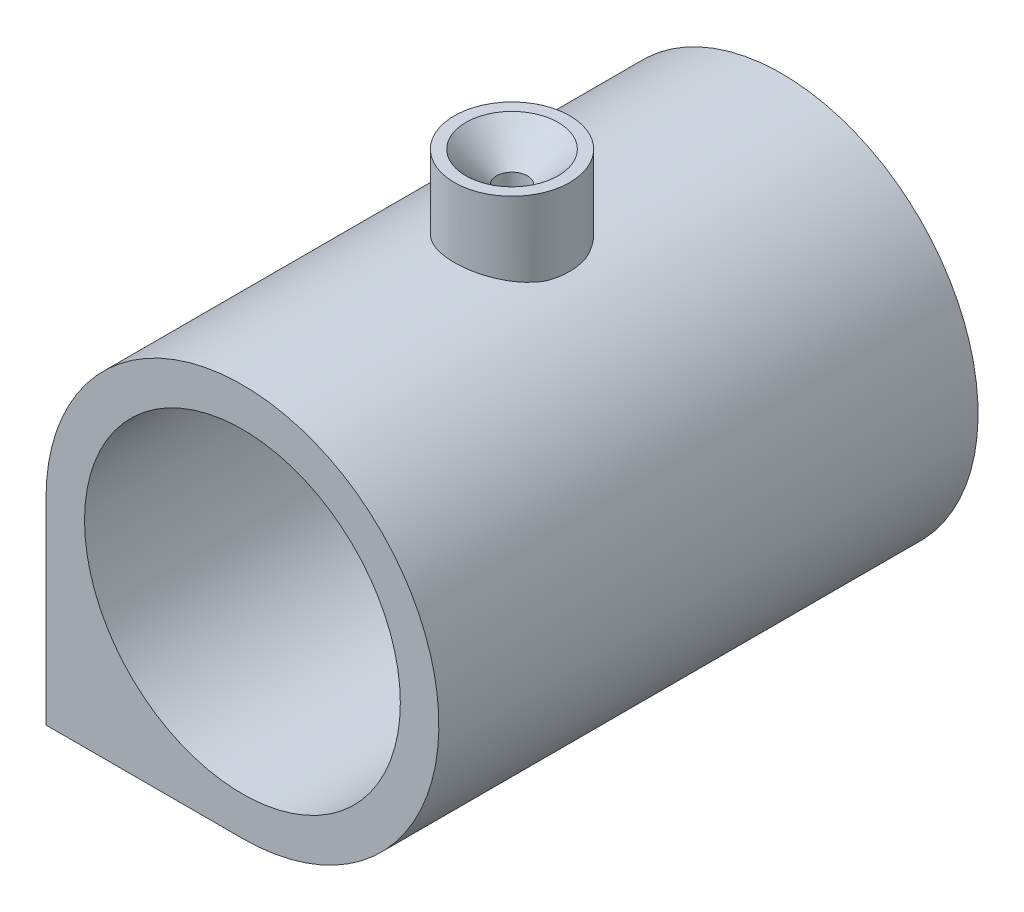
ISO-10303-21;
HEADER;
FILE_DESCRIPTION(('STEP AP214'),'2;1');
FILE_NAME('part.step','',(''),(''),'','','');
FILE_SCHEMA(('AUTOMOTIVE_DESIGN { 1 0 10303 214 1 1 1 1 }'));
ENDSEC;
DATA;
#1=APPLICATION_CONTEXT('core data for automotive mechanical design processes');
#2=APPLICATION_PROTOCOL_DEFINITION('international standard','automotive_design',2000,#1);
#3=PRODUCT_CONTEXT('',#1,'mechanical');
#4=PRODUCT('Part','Part','',(#3));
#5=PRODUCT_RELATED_PRODUCT_CATEGORY('part','',(#4));
#6=PRODUCT_DEFINITION_FORMATION('','',#4);
#7=PRODUCT_DEFINITION_CONTEXT('part definition',#1,'design');
#8=PRODUCT_DEFINITION('design','',#6,#7);
#9=PRODUCT_DEFINITION_SHAPE('','',#8);
#10=(LENGTH_UNIT() NAMED_UNIT(*) SI_UNIT(.MILLI.,.METRE.));
#11=(NAMED_UNIT(*) PLANE_ANGLE_UNIT() SI_UNIT($,.RADIAN.));
#12=(NAMED_UNIT(*) SI_UNIT($,.STERADIAN.) SOLID_ANGLE_UNIT());
#13=UNCERTAINTY_MEASURE_WITH_UNIT(LENGTH_MEASURE(1.E-05),#10,'distance_accuracy_value','');
#14=(GEOMETRIC_REPRESENTATION_CONTEXT(3) GLOBAL_UNCERTAINTY_ASSIGNED_CONTEXT((#13)) GLOBAL_UNIT_ASSIGNED_CONTEXT((#10,
#11,#12)) REPRESENTATION_CONTEXT('',''));
#15=CARTESIAN_POINT('',(0.,0.,0.));
#16=DIRECTION('',(0.,0.,1.));
#17=DIRECTION('',(1.,0.,0.));
#18=AXIS2_PLACEMENT_3D('',#15,#16,#17);
#19=CARTESIAN_POINT('',(77.5,0.,0.));
#20=DIRECTION('',(-1.,0.,0.));
#21=DIRECTION('',(0.,-1.,0.));
#22=AXIS2_PLACEMENT_3D('',#19,#20,#21);
#23=PLANE('',#22);
#24=DIRECTION('',(0.,1.,0.));
#25=VECTOR('',#24,1.);
#26=CARTESIAN_POINT('',(77.5,7.75,30.25));
#27=LINE('',#26,#25);
#28=CARTESIAN_POINT('',(77.5,2.25,30.25));
#29=VERTEX_POINT('',#28);
#30=CARTESIAN_POINT('',(77.5,7.75,30.25));
#31=VERTEX_POINT('',#30);
#32=EDGE_CURVE('E56',#29,#31,#27,.T.);
#33=ORIENTED_EDGE('',*,*,#32,.F.);
#34=DIRECTION('',(0.,0.,1.));
#35=VECTOR('',#34,1.);
#36=CARTESIAN_POINT('',(77.5,2.25,-30.25));
#37=LINE('',#36,#35);
#38=CARTESIAN_POINT('',(77.5,2.25,-30.25));
#39=VERTEX_POINT('',#38);
#40=EDGE_CURVE('E132',#39,#29,#37,.T.);
#41=ORIENTED_EDGE('',*,*,#40,.F.);
#42=DIRECTION('',(0.,-1.,0.));
#43=VECTOR('',#42,1.);
#44=CARTESIAN_POINT('',(77.5,7.75,-30.25));
#45=LINE('',#44,#43);
#46=CARTESIAN_POINT('',(77.5,7.75,-30.25));
#47=VERTEX_POINT('',#46);
#48=EDGE_CURVE('E135',#47,#39,#45,.T.);
#49=ORIENTED_EDGE('',*,*,#48,.F.);
#50=DIRECTION('',(0.,0.,-1.));
#51=VECTOR('',#50,1.);
#52=CARTESIAN_POINT('',(77.5,7.75,-30.25));
#53=LINE('',#52,#51);
#54=EDGE_CURVE('E141',#31,#47,#53,.T.);
#55=ORIENTED_EDGE('',*,*,#54,.F.);
#56=EDGE_LOOP('',(#33,#41,#49,#55));
#57=FACE_BOUND('',#56,.T.);
#58=DIRECTION('',(0.,0.,1.));
#59=VECTOR('',#58,1.);
#60=CARTESIAN_POINT('',(77.5,0.,0.));
#61=LINE('',#60,#59);
#62=CARTESIAN_POINT('',(77.5,0.,-35.));
#63=VERTEX_POINT('',#62);
#64=CARTESIAN_POINT('',(77.5,0.,35.));
#65=VERTEX_POINT('',#64);
#66=EDGE_CURVE('E43',#63,#65,#61,.T.);
#67=ORIENTED_EDGE('',*,*,#66,.T.);
#68=DIRECTION('',(0.,-1.,0.));
#69=VECTOR('',#68,1.);
#70=CARTESIAN_POINT('',(77.5,0.,35.));
#71=LINE('',#70,#69);
#72=CARTESIAN_POINT('',(77.5,25.5,35.));
#73=VERTEX_POINT('',#72);
#74=EDGE_CURVE('E223',#73,#65,#71,.T.);
#75=ORIENTED_EDGE('',*,*,#74,.F.);
#76=DIRECTION('',(0.,0.,-1.));
#77=VECTOR('',#76,1.);
#78=CARTESIAN_POINT('',(77.5,25.5,35.));
#79=LINE('',#78,#77);
#80=CARTESIAN_POINT('',(77.5,25.5,-35.));
#81=VERTEX_POINT('',#80);
#82=EDGE_CURVE('E208',#73,#81,#79,.T.);
#83=ORIENTED_EDGE('',*,*,#82,.T.);
#84=DIRECTION('',(0.,-1.,0.));
#85=VECTOR('',#84,1.);
#86=CARTESIAN_POINT('',(77.5,0.,-35.));
#87=LINE('',#86,#85);
#88=EDGE_CURVE('E226',#81,#63,#87,.T.);
#89=ORIENTED_EDGE('',*,*,#88,.T.);
#90=EDGE_LOOP('',(#67,#75,#83,#89));
#91=FACE_BOUND('',#90,.T.);
#92=ADVANCED_FACE('F39',(#57,#91),#23,.T.);
#93=CARTESIAN_POINT('',(103.,56.,0.));
#94=DIRECTION('',(0.,1.,0.));
#95=DIRECTION('',(0.,0.,1.));
#96=AXIS2_PLACEMENT_3D('',#93,#94,#95);
#97=CONICAL_SURFACE('',#96,2.,0.785398163397447);
#98=CARTESIAN_POINT('',(103.,60.,0.));
#99=DIRECTION('',(0.,1.,0.));
#100=DIRECTION('',(0.,0.,1.));
#101=AXIS2_PLACEMENT_3D('',#98,#99,#100);
#102=CIRCLE('',#101,6.00000000000001);
#103=CARTESIAN_POINT('',(103.,60.,5.99999999999999));
#104=VERTEX_POINT('',#103);
#105=EDGE_CURVE('E150',#104,#104,#102,.F.);
#106=CARTESIAN_POINT('',(103.,56.,0.));
#107=DIRECTION('',(0.,1.,0.));
#108=DIRECTION('',(0.,0.,1.));
#109=AXIS2_PLACEMENT_3D('',#106,#107,#108);
#110=CIRCLE('',#109,2.);
#111=CARTESIAN_POINT('',(103.,56.,1.99999999999999));
#112=VERTEX_POINT('',#111);
#113=EDGE_CURVE('E153',#112,#112,#110,.T.);
#114=CARTESIAN_POINT('',(103.,60.,5.99999999999999));
#115=CARTESIAN_POINT('',(103.,59.9583333333333,5.95833333333333));
#116=CARTESIAN_POINT('',(103.,59.9166666666667,5.91666666666666));
#117=CARTESIAN_POINT('',(103.,59.8333333333333,5.83333333333333));
#118=CARTESIAN_POINT('',(103.,59.7916666666667,5.79166666666666));
#119=CARTESIAN_POINT('',(103.,59.7083333333333,5.70833333333333));
#120=CARTESIAN_POINT('',(103.,59.6666666666667,5.66666666666666));
#121=CARTESIAN_POINT('',(103.,59.5833333333333,5.58333333333333));
#122=CARTESIAN_POINT('',(103.,59.5416666666667,5.54166666666666));
#123=CARTESIAN_POINT('',(103.,59.4583333333333,5.45833333333333));
#124=CARTESIAN_POINT('',(103.,59.4166666666667,5.41666666666666));
#125=CARTESIAN_POINT('',(103.,59.3333333333333,5.33333333333333));
#126=CARTESIAN_POINT('',(103.,59.2916666666667,5.29166666666666));
#127=CARTESIAN_POINT('',(103.,59.2083333333333,5.20833333333333));
#128=CARTESIAN_POINT('',(103.,59.1666666666667,5.16666666666666));
#129=CARTESIAN_POINT('',(103.,59.0833333333333,5.08333333333333));
#130=CARTESIAN_POINT('',(103.,59.0416666666667,5.04166666666666));
#131=CARTESIAN_POINT('',(103.,58.9583333333333,4.95833333333333));
#132=CARTESIAN_POINT('',(103.,58.9166666666667,4.91666666666666));
#133=CARTESIAN_POINT('',(103.,58.8333333333333,4.83333333333333));
#134=CARTESIAN_POINT('',(103.,58.7916666666667,4.79166666666666));
#135=CARTESIAN_POINT('',(103.,58.7083333333333,4.70833333333333));
#136=CARTESIAN_POINT('',(103.,58.6666666666667,4.66666666666666));
#137=CARTESIAN_POINT('',(103.,58.5833333333333,4.58333333333333));
#138=CARTESIAN_POINT('',(103.,58.5416666666667,4.54166666666666));
#139=CARTESIAN_POINT('',(103.,58.4583333333333,4.45833333333332));
#140=CARTESIAN_POINT('',(103.,58.4166666666667,4.41666666666666));
#141=CARTESIAN_POINT('',(103.,58.3333333333333,4.33333333333332));
#142=CARTESIAN_POINT('',(103.,58.2916666666667,4.29166666666666));
#143=CARTESIAN_POINT('',(103.,58.2083333333333,4.20833333333332));
#144=CARTESIAN_POINT('',(103.,58.1666666666667,4.16666666666666));
#145=CARTESIAN_POINT('',(103.,58.0833333333333,4.08333333333332));
#146=CARTESIAN_POINT('',(103.,58.0416666666667,4.04166666666666));
#147=CARTESIAN_POINT('',(103.,57.9583333333333,3.95833333333332));
#148=CARTESIAN_POINT('',(103.,57.9166666666667,3.91666666666666));
#149=CARTESIAN_POINT('',(103.,57.8333333333333,3.83333333333332));
#150=CARTESIAN_POINT('',(103.,57.7916666666667,3.79166666666666));
#151=CARTESIAN_POINT('',(103.,57.7083333333333,3.70833333333332));
#152=CARTESIAN_POINT('',(103.,57.6666666666667,3.66666666666666));
#153=CARTESIAN_POINT('',(103.,57.5833333333333,3.58333333333332));
#154=CARTESIAN_POINT('',(103.,57.5416666666667,3.54166666666666));
#155=CARTESIAN_POINT('',(103.,57.4583333333333,3.45833333333332));
#156=CARTESIAN_POINT('',(103.,57.4166666666667,3.41666666666666));
#157=CARTESIAN_POINT('',(103.,57.3333333333333,3.33333333333332));
#158=CARTESIAN_POINT('',(103.,57.2916666666667,3.29166666666665));
#159=CARTESIAN_POINT('',(103.,57.2083333333333,3.20833333333332));
#160=CARTESIAN_POINT('',(103.,57.1666666666667,3.16666666666665));
#161=CARTESIAN_POINT('',(103.,57.0833333333333,3.08333333333332));
#162=CARTESIAN_POINT('',(103.,57.0416666666667,3.04166666666665));
#163=CARTESIAN_POINT('',(103.,56.9583333333333,2.95833333333332));
#164=CARTESIAN_POINT('',(103.,56.9166666666667,2.91666666666665));
#165=CARTESIAN_POINT('',(103.,56.8333333333333,2.83333333333332));
#166=CARTESIAN_POINT('',(103.,56.7916666666667,2.79166666666665));
#167=CARTESIAN_POINT('',(103.,56.7083333333333,2.70833333333332));
#168=CARTESIAN_POINT('',(103.,56.6666666666667,2.66666666666665));
#169=CARTESIAN_POINT('',(103.,56.5833333333333,2.58333333333332));
#170=CARTESIAN_POINT('',(103.,56.5416666666667,2.54166666666665));
#171=CARTESIAN_POINT('',(103.,56.4583333333333,2.45833333333332));
#172=CARTESIAN_POINT('',(103.,56.4166666666667,2.41666666666665));
#173=CARTESIAN_POINT('',(103.,56.3333333333333,2.33333333333332));
#174=CARTESIAN_POINT('',(103.,56.2916666666667,2.29166666666665));
#175=CARTESIAN_POINT('',(103.,56.2083333333333,2.20833333333332));
#176=CARTESIAN_POINT('',(103.,56.1666666666667,2.16666666666665));
#177=CARTESIAN_POINT('',(103.,56.0833333333333,2.08333333333332));
#178=CARTESIAN_POINT('',(103.,56.0416666666667,2.04166666666665));
#179=CARTESIAN_POINT('',(103.,56.,1.99999999999999));
#180=B_SPLINE_CURVE_WITH_KNOTS('',3,(#114,#115,#116,#117,#118,#119,#120,#121,#122,#123,#124,
#125,#126,#127,#128,#129,#130,#131,#132,#133,#134,#135,#136,#137,#138,#139,#140,#141,#142,#143,
#144,#145,#146,#147,#148,#149,#150,#151,#152,#153,#154,#155,#156,#157,#158,#159,#160,#161,#162,
#163,#164,#165,#166,#167,#168,#169,#170,#171,#172,#173,#174,#175,#176,#177,#178,#179),
.UNSPECIFIED.,.F.,.F.,(4,2,2,2,2,2,2,2,2,2,2,2,2,2,2,2,2,2,2,2,2,2,2,2,2,2,2,2,2,2,2,2,4),(0.,
0.176776695296638,0.353553390593275,0.530330085889912,0.707106781186549,0.883883476483186,
1.06066017177982,1.23743686707646,1.4142135623731,1.59099025766973,1.76776695296637,
1.94454364826301,2.12132034355965,2.29809703885628,2.47487373415292,2.65165042944956,
2.8284271247462,3.00520382004284,3.18198051533947,3.35875721063611,3.53553390593275,
3.71231060122939,3.88908729652602,4.06586399182266,4.2426406871193,4.41941738241593,
4.59619407771257,4.77297077300921,4.94974746830585,5.12652416360248,5.30330085889912,
5.48007755419576,5.6568542494924),.UNSPECIFIED.);
#181=EDGE_CURVE('BSEAM192',#104,#112,#180,.T.);
#182=ORIENTED_EDGE('',*,*,#105,.F.);
#183=ORIENTED_EDGE('',*,*,#113,.F.);
#184=ORIENTED_EDGE('',*,*,#181,.T.);
#185=ORIENTED_EDGE('',*,*,#181,.F.);
#186=EDGE_LOOP('',(#182,#184,#183,#185));
#187=FACE_BOUND('',#186,.T.);
#188=ADVANCED_FACE('F192',(#187),#97,.F.);
#189=CARTESIAN_POINT('',(103.,60.,0.));
#190=DIRECTION('',(0.,1.,0.));
#191=DIRECTION('',(0.,0.,1.));
#192=AXIS2_PLACEMENT_3D('',#189,#190,#191);
#193=PLANE('',#192);
#194=ORIENTED_EDGE('',*,*,#105,.T.);
#195=EDGE_LOOP('',(#194));
#196=FACE_BOUND('',#195,.T.);
#197=CARTESIAN_POINT('',(103.,60.,0.));
#198=DIRECTION('',(0.,1.,0.));
#199=DIRECTION('',(0.,0.,1.));
#200=AXIS2_PLACEMENT_3D('',#197,#198,#199);
#201=CIRCLE('',#200,7.50000000000001);
#202=CARTESIAN_POINT('',(103.,60.,7.50000000000001));
#203=VERTEX_POINT('',#202);
#204=EDGE_CURVE('E205',#203,#203,#201,.T.);
#205=ORIENTED_EDGE('',*,*,#204,.T.);
#206=EDGE_LOOP('',(#205));
#207=FACE_BOUND('',#206,.T.);
#208=ADVANCED_FACE('F188',(#196,#207),#193,.T.);
#209=CARTESIAN_POINT('',(103.,-0.001000000000001,0.));
#210=DIRECTION('',(0.,1.,0.));
#211=DIRECTION('',(0.,0.,1.));
#212=AXIS2_PLACEMENT_3D('',#209,#210,#211);
#213=CYLINDRICAL_SURFACE('',#212,2.);
#214=ORIENTED_EDGE('',*,*,#113,.T.);
#215=EDGE_LOOP('',(#214));
#216=FACE_BOUND('',#215,.T.);
#217=CARTESIAN_POINT('',(103.,46.,1.99999999999999));
#218=CARTESIAN_POINT('',(103.112055118297,45.9999987386317,1.99999514060117));
#219=CARTESIAN_POINT('',(103.22418466831,45.999071475106,1.99055103639975));
#220=CARTESIAN_POINT('',(103.445336088255,45.995461599852,1.95301866639838));
#221=CARTESIAN_POINT('',(103.554354379701,45.992777045632,1.92490976822595));
#222=CARTESIAN_POINT('',(103.766048698073,45.9859556789613,1.85087302777091));
#223=CARTESIAN_POINT('',(103.86872847494,45.9818197350429,1.80495584049775));
#224=CARTESIAN_POINT('',(104.064900752455,45.9725582727556,1.69662637479773));
#225=CARTESIAN_POINT('',(104.158395096562,45.9674329535627,1.63421741547872));
#226=CARTESIAN_POINT('',(104.333886297143,45.9567473510947,1.49444580813626));
#227=CARTESIAN_POINT('',(104.415847200191,45.9511857883102,1.41703811216867));
#228=CARTESIAN_POINT('',(104.565636011835,45.940265125924,1.24956231842826));
#229=CARTESIAN_POINT('',(104.633463272044,45.93490603562,1.15949364014534));
#230=CARTESIAN_POINT('',(104.753185959775,45.9249839183537,0.969028624111627));
#231=CARTESIAN_POINT('',(104.80504898754,45.920422518314,0.868611828470055));
#232=CARTESIAN_POINT('',(104.891164115931,45.9126279274825,0.660443008272744));
#233=CARTESIAN_POINT('',(104.925416631999,45.9093947053588,0.552691156822688));
#234=CARTESIAN_POINT('',(104.975232175371,45.9046339961254,0.333276682265682));
#235=CARTESIAN_POINT('',(104.990854685748,45.9031010812673,0.221627683845366));
#236=CARTESIAN_POINT('',(105.003150607662,45.9018976534529,-0.00271739116219227));
#237=CARTESIAN_POINT('',(104.999824494757,45.9022270937568,-0.115413441400501));
#238=CARTESIAN_POINT('',(104.974366634283,45.9047062007368,-0.33824393576703));
#239=CARTESIAN_POINT('',(104.952299786513,45.9068495855721,-0.448385874249353));
#240=CARTESIAN_POINT('',(104.890087811417,45.9127052572463,-0.66339537549614));
#241=CARTESIAN_POINT('',(104.849942450481,45.9164175643586,-0.768262870084765));
#242=CARTESIAN_POINT('',(104.752641229847,45.9250000260275,-0.969951979544357));
#243=CARTESIAN_POINT('',(104.695456525324,45.9298721411142,-1.06675959194209));
#244=CARTESIAN_POINT('',(104.565720618827,45.940223572557,-1.24942771363365));
#245=CARTESIAN_POINT('',(104.493168988901,45.9457029058215,-1.33528791794737));
#246=CARTESIAN_POINT('',(104.33439598481,45.9566793757017,-1.49400113346195));
#247=CARTESIAN_POINT('',(104.248118552542,45.962176490598,-1.56679807872253));
#248=CARTESIAN_POINT('',(104.064537843663,45.9725474048768,-1.69688395130023));
#249=CARTESIAN_POINT('',(103.967234555576,45.9774212036104,-1.75417286247561));
#250=CARTESIAN_POINT('',(103.764325751896,45.9859978296919,-1.85161400057713));
#251=CARTESIAN_POINT('',(103.658718889056,45.9897004665282,-1.89176343981594));
#252=CARTESIAN_POINT('',(103.442218792031,45.9955156024944,-1.95374513804601));
#253=CARTESIAN_POINT('',(103.331325708391,45.9976281468793,-1.97557791834152));
#254=CARTESIAN_POINT('',(103.107886619671,46.000019258317,-2.00023555075399));
#255=CARTESIAN_POINT('',(102.995349230267,46.000305291138,-2.00313778152354));
#256=CARTESIAN_POINT('',(102.771389624482,45.9990311576163,-1.99005508110186));
#257=CARTESIAN_POINT('',(102.659967393791,45.9974710149938,-1.9740703925754));
#258=CARTESIAN_POINT('',(102.44162388447,45.9926846542083,-1.92373178493305));
#259=CARTESIAN_POINT('',(102.334694188217,45.9894617173387,-1.88941403884912));
#260=CARTESIAN_POINT('',(102.128109577808,45.9817114137955,-1.80342060926111));
#261=CARTESIAN_POINT('',(102.028454819343,45.9771840192152,-1.75174455440124));
#262=CARTESIAN_POINT('',(101.838898703718,45.9673127926894,-1.63230909950557));
#263=CARTESIAN_POINT('',(101.749029556731,45.9619663961097,-1.5644987940307));
#264=CARTESIAN_POINT('',(101.581921623601,45.9510654935712,-1.41479279932738));
#265=CARTESIAN_POINT('',(101.504683139044,45.9455109826469,-1.3328967738646));
#266=CARTESIAN_POINT('',(101.36476089008,45.9347974735107,-1.15700672966077));
#267=CARTESIAN_POINT('',(101.302127864042,45.9296398945817,-1.06297224944762));
#268=CARTESIAN_POINT('',(101.193543110116,45.920325565535,-0.865674446724975));
#269=CARTESIAN_POINT('',(101.147591163652,45.9161688023036,-0.762411245163314));
#270=CARTESIAN_POINT('',(101.073758151703,45.9093354686106,-0.549762158182014));
#271=CARTESIAN_POINT('',(101.04584675996,45.9066564152293,-0.440386885305484));
#272=CARTESIAN_POINT('',(101.008788707772,45.9030740265504,-0.218474790289398));
#273=CARTESIAN_POINT('',(100.999641537378,45.9021706429962,-0.105938054152022));
#274=CARTESIAN_POINT('',(101.000378470131,45.9022428445945,0.118598171854959));
#275=CARTESIAN_POINT('',(101.01018286763,45.903210560367,0.230597934394806));
#276=CARTESIAN_POINT('',(101.04837764998,45.9068991531074,0.451351335463303));
#277=CARTESIAN_POINT('',(101.076768057048,45.9096200321709,0.560104970111642));
#278=CARTESIAN_POINT('',(101.151307242161,45.9165062113761,0.771279291333051));
#279=CARTESIAN_POINT('',(101.197453818963,45.9206713324677,0.873700761083119));
#280=CARTESIAN_POINT('',(101.306187101971,45.9299770492896,1.06935692983205));
#281=CARTESIAN_POINT('',(101.368773690129,45.9351176380153,1.16259169479008));
#282=CARTESIAN_POINT('',(101.508909847521,45.945820950492,1.33763631801491));
#283=CARTESIAN_POINT('',(101.586518772401,45.9513852938365,1.41939855964621));
#284=CARTESIAN_POINT('',(101.754380249558,45.9622943497929,1.56877512815348));
#285=CARTESIAN_POINT('',(101.844635830585,45.9676390093949,1.63638605622624));
#286=CARTESIAN_POINT('',(102.035465133274,45.977519777667,1.75566762454651));
#287=CARTESIAN_POINT('',(102.136063223959,45.9820539044482,1.8072994123619));
#288=CARTESIAN_POINT('',(102.344480533583,45.9897809682009,1.89286987758032));
#289=CARTESIAN_POINT('',(102.452291428925,45.9929754212287,1.92682856548671));
#290=CARTESIAN_POINT('',(102.633930640885,45.9968577956736,1.96759262216753));
#291=CARTESIAN_POINT('',(102.706596682951,45.9980306482258,1.97972885570547));
#292=CARTESIAN_POINT('',(102.852831115288,45.9996021631359,1.9959341248596));
#293=CARTESIAN_POINT('',(102.926399502059,46.000000828497,2.00000319177006));
#294=CARTESIAN_POINT('',(103.,46.,1.99999999999999));
#295=B_SPLINE_CURVE_WITH_KNOTS('',3,(#217,#218,#219,#220,#221,#222,#223,#224,#225,#226,#227,
#228,#229,#230,#231,#232,#233,#234,#235,#236,#237,#238,#239,#240,#241,#242,#243,#244,#245,#246,
#247,#248,#249,#250,#251,#252,#253,#254,#255,#256,#257,#258,#259,#260,#261,#262,#263,#264,#265,
#266,#267,#268,#269,#270,#271,#272,#273,#274,#275,#276,#277,#278,#279,#280,#281,#282,#283,#284,
#285,#286,#287,#288,#289,#290,#291,#292,#293,#294),.UNSPECIFIED.,.T.,.F.,(4,2,2,2,2,2,2,2,2,2,2,
2,2,2,2,2,2,2,2,2,2,2,2,2,2,2,2,2,2,2,2,2,2,2,2,2,2,2,4),(0.,0.335896599613486,
0.672165124399248,1.00823276348817,1.34423281758225,1.68125812727403,2.01829889472737,
2.35601925108153,2.69373164007185,3.03036284743264,3.36698560633151,3.70244736052759,
4.03791344968534,4.37395068598547,4.70999728178775,5.04745334324657,5.38490975594946,
5.72242103410452,6.05992270613898,6.39604397039322,6.73216091610809,7.06761710438999,
7.40308046972675,7.73961663418718,8.07616083307701,8.41385730311549,8.75154934809141,
9.08867224454339,9.42578597900945,9.76148498018369,10.097184382625,10.4328421815703,
10.7684975703674,11.105507305527,11.442597889628,11.7805017665503,12.1180222122315,
12.3386480369782,12.5592730058683),.UNSPECIFIED.);
#296=CARTESIAN_POINT('',(103.,46.,1.99999999999999));
#297=VERTEX_POINT('',#296);
#298=EDGE_CURVE('E11',#297,#297,#295,.T.);
#299=ORIENTED_EDGE('',*,*,#298,.F.);
#300=EDGE_LOOP('',(#299));
#301=FACE_BOUND('',#300,.T.);
#302=ADVANCED_FACE('F191',(#216,#301),#213,.F.);
#303=CARTESIAN_POINT('',(103.,50.,0.));
#304=DIRECTION('',(0.,1.,0.));
#305=DIRECTION('',(0.,0.,1.));
#306=AXIS2_PLACEMENT_3D('',#303,#304,#305);
#307=PLANE('',#306);
#308=CARTESIAN_POINT('',(103.,50.,0.));
#309=DIRECTION('',(0.,1.,0.));
#310=DIRECTION('',(0.,0.,1.));
#311=AXIS2_PLACEMENT_3D('',#308,#309,#310);
#312=CIRCLE('',#311,7.50000000000001);
#313=CARTESIAN_POINT('',(95.9289321881346,50.,-2.50000000000021));
#314=VERTEX_POINT('',#313);
#315=CARTESIAN_POINT('',(95.9289321881346,50.,2.5000000000002));
#316=VERTEX_POINT('',#315);
#317=EDGE_CURVE('E48',#314,#316,#312,.T.);
#318=ORIENTED_EDGE('',*,*,#317,.F.);
#319=DIRECTION('',(0.,0.,-1.));
#320=VECTOR('',#319,1.);
#321=CARTESIAN_POINT('',(95.9289321881346,50.,35.));
#322=LINE('',#321,#320);
#323=EDGE_CURVE('E211',#314,#316,#322,.F.);
#324=ORIENTED_EDGE('',*,*,#323,.T.);
#325=EDGE_LOOP('',(#318,#324));
#326=FACE_BOUND('',#325,.T.);
#327=ADVANCED_FACE('F181',(#326),#307,.F.);
#328=CARTESIAN_POINT('',(103.,60.,0.));
#329=DIRECTION('',(0.,-1.,0.));
#330=DIRECTION('',(0.,0.,-1.));
#331=AXIS2_PLACEMENT_3D('',#328,#329,#330);
#332=CYLINDRICAL_SURFACE('',#331,7.50000000000001);
#333=ORIENTED_EDGE('',*,*,#204,.F.);
#334=EDGE_LOOP('',(#333));
#335=FACE_BOUND('',#334,.T.);
#336=ORIENTED_EDGE('',*,*,#317,.T.);
#337=CARTESIAN_POINT('',(95.9289321881346,50.,2.50000000000022));
#338=CARTESIAN_POINT('',(95.9997163011724,50.0204183295653,2.70026953235193));
#339=CARTESIAN_POINT('',(96.078969436612,50.0429708535467,2.89730191613239));
#340=CARTESIAN_POINT('',(96.2536602759481,50.0915688249665,3.28355477768137));
#341=CARTESIAN_POINT('',(96.3490940956403,50.1176134338101,3.47277711674283));
#342=CARTESIAN_POINT('',(96.5553238888429,50.1724031190231,3.84198410069792));
#343=CARTESIAN_POINT('',(96.6661043428728,50.2011454579265,4.02197782931467));
#344=CARTESIAN_POINT('',(96.9022895812246,50.2605080767262,4.37177999261605));
#345=CARTESIAN_POINT('',(97.0276950273412,50.2911284415753,4.54158796585872));
#346=CARTESIAN_POINT('',(97.2921918833454,50.3533572364444,4.86983903703142));
#347=CARTESIAN_POINT('',(97.4312760006818,50.3849651339108,5.0282881136929));
#348=CARTESIAN_POINT('',(97.7223196090127,50.4483120190481,5.33296238066997));
#349=CARTESIAN_POINT('',(97.8742835336389,50.4800510482532,5.47918332698874));
#350=CARTESIAN_POINT('',(98.1900558232129,50.542770219499,5.75837190467401));
#351=CARTESIAN_POINT('',(98.3538630977859,50.5737504310508,5.89134075343955));
#352=CARTESIAN_POINT('',(98.6922874189905,50.6341033314322,6.14313386873728));
#353=CARTESIAN_POINT('',(98.8669043037073,50.6634760443278,6.26195834705703));
#354=CARTESIAN_POINT('',(99.2276701188968,50.7200951845619,6.48575717772437));
#355=CARTESIAN_POINT('',(99.4139190868619,50.7473166697997,6.59057671400558));
#356=CARTESIAN_POINT('',(99.7949761576524,50.7985129921025,6.78405958784795));
#357=CARTESIAN_POINT('',(99.9897812045818,50.8224889760434,6.87272863642042));
#358=CARTESIAN_POINT('',(100.386656808964,50.866519207222,7.03322514558528));
#359=CARTESIAN_POINT('',(100.588727791109,50.8865732247794,7.10505161988283));
#360=CARTESIAN_POINT('',(100.998643098933,50.9221731122311,7.23122071075577));
#361=CARTESIAN_POINT('',(101.206487235522,50.9377191295872,7.28556389923604));
#362=CARTESIAN_POINT('',(101.620059233597,50.9634520991658,7.37490110742899));
#363=CARTESIAN_POINT('',(101.825663061015,50.9737860294711,7.41042741136717));
#364=CARTESIAN_POINT('',(102.239300740647,50.9894912877469,7.464236783542));
#365=CARTESIAN_POINT('',(102.447334522145,50.9948627597708,7.48252035231248));
#366=CARTESIAN_POINT('',(102.86423368138,51.0004905742762,7.50167337517276));
#367=CARTESIAN_POINT('',(103.073098903161,51.0007478346493,7.50254595416292));
#368=CARTESIAN_POINT('',(103.490116448715,50.9961421535399,7.48687659867276));
#369=CARTESIAN_POINT('',(103.698268782791,50.9912792863721,7.47033491694687));
#370=CARTESIAN_POINT('',(104.106380398626,50.9767820443591,7.42071194179897));
#371=CARTESIAN_POINT('',(104.30640395217,50.9672878247333,7.38811621605223));
#372=CARTESIAN_POINT('',(104.702974719899,50.9438469103447,7.30690470984299));
#373=CARTESIAN_POINT('',(104.899520750041,50.9298987287368,7.25828357952052));
#374=CARTESIAN_POINT('',(105.287696459078,50.8979205445278,7.1454385798919));
#375=CARTESIAN_POINT('',(105.479327049322,50.8798913047552,7.08121762633019));
#376=CARTESIAN_POINT('',(105.856465583336,50.8402163152299,6.93767380564797));
#377=CARTESIAN_POINT('',(106.04197320633,50.8185703763599,6.85835014877685));
#378=CARTESIAN_POINT('',(106.408341757614,50.7718777743815,6.68393346592119));
#379=CARTESIAN_POINT('',(106.589095480981,50.7467861241888,6.58862735600824));
#380=CARTESIAN_POINT('',(106.941957966968,50.6941023886495,6.38377542698363));
#381=CARTESIAN_POINT('',(107.114066687015,50.666510290991,6.27422953775622));
#382=CARTESIAN_POINT('',(107.448686131408,50.6095204214977,6.04158404415472));
#383=CARTESIAN_POINT('',(107.611191651536,50.5801216878884,5.91847719238906));
#384=CARTESIAN_POINT('',(107.925534271558,50.5202860816089,5.6595562618643));
#385=CARTESIAN_POINT('',(108.07737132439,50.4898492043598,5.52374212705337));
#386=CARTESIAN_POINT('',(108.375002971959,50.4275616225187,5.23487909985959));
#387=CARTESIAN_POINT('',(108.520351710206,50.3957009900536,5.08137259136126));
#388=CARTESIAN_POINT('',(108.79758496899,50.3326039209949,4.76262605408074));
#389=CARTESIAN_POINT('',(108.929474225513,50.3013672679749,4.59739018744811));
#390=CARTESIAN_POINT('',(109.178810764869,50.2404275581963,4.25639062330605));
#391=CARTESIAN_POINT('',(109.296274371942,50.2107227904454,4.08063916678162));
#392=CARTESIAN_POINT('',(109.516051214697,50.1536805085482,3.71963730790013));
#393=CARTESIAN_POINT('',(109.618371781944,50.126341851519,3.53439156111816));
#394=CARTESIAN_POINT('',(109.780977895322,50.0819720405697,3.20807539116987));
#395=CARTESIAN_POINT('',(109.845055832132,50.0641834934536,3.06898354192604));
#396=CARTESIAN_POINT('',(109.964566463457,50.030565025959,2.78715273253248));
#397=CARTESIAN_POINT('',(110.020011927652,50.0147322198381,2.64441953004404));
#398=CARTESIAN_POINT('',(110.071067811865,50.,2.50000000000015));
#399=B_SPLINE_CURVE_WITH_KNOTS('',3,(#337,#338,#339,#340,#341,#342,#343,#344,#345,#346,#347,
#348,#349,#350,#351,#352,#353,#354,#355,#356,#357,#358,#359,#360,#361,#362,#363,#364,#365,#366,
#367,#368,#369,#370,#371,#372,#373,#374,#375,#376,#377,#378,#379,#380,#381,#382,#383,#384,#385,
#386,#387,#388,#389,#390,#391,#392,#393,#394,#395,#396,#397,#398),.UNSPECIFIED.,.F.,.F.,(4,2,2,
2,2,2,2,2,2,2,2,2,2,2,2,2,2,2,2,2,2,2,2,2,2,2,2,2,2,2,4),(0.,0.639932883782017,1.2797123673782,
1.91884952556745,2.5580156165457,3.19684277539499,3.83589073863396,4.47487994175122,
5.11385957590296,5.75940319826486,6.40471810340001,7.05007078850207,7.69540236098892,
8.32134518085484,8.94726982986827,9.5730821377806,10.1988853626396,10.8068262508526,
11.4149702976453,12.0230007643012,12.6310630348252,13.2479921575818,13.864924318173,
14.4821878005454,15.0994540057953,15.7400705093722,16.3804608164322,17.0201196387715,
17.6594677472979,18.1217009242817,18.5832437047118),.UNSPECIFIED.);
#400=CARTESIAN_POINT('',(110.071067811865,50.,2.50000000000014));
#401=VERTEX_POINT('',#400);
#402=EDGE_CURVE('E64',#316,#401,#399,.T.);
#403=ORIENTED_EDGE('',*,*,#402,.T.);
#404=CARTESIAN_POINT('',(110.071067811865,50.,-2.50000000000016));
#405=VERTEX_POINT('',#404);
#406=EDGE_CURVE('E240',#401,#405,#312,.T.);
#407=ORIENTED_EDGE('',*,*,#406,.T.);
#408=CARTESIAN_POINT('',(110.071067811865,50.,-2.50000000000016));
#409=CARTESIAN_POINT('',(110.000283698828,50.0204183295653,-2.70026953235187));
#410=CARTESIAN_POINT('',(109.921030563388,50.0429708535467,-2.89730191613232));
#411=CARTESIAN_POINT('',(109.746339724052,50.0915688249665,-3.2835547776813));
#412=CARTESIAN_POINT('',(109.65090590436,50.1176134338101,-3.47277711674277));
#413=CARTESIAN_POINT('',(109.444676111157,50.1724031190231,-3.84198410069786));
#414=CARTESIAN_POINT('',(109.333895657127,50.2011454579265,-4.02197782931461));
#415=CARTESIAN_POINT('',(109.097710418775,50.2605080767262,-4.371779992616));
#416=CARTESIAN_POINT('',(108.972304972659,50.2911284415753,-4.54158796585867));
#417=CARTESIAN_POINT('',(108.707808116655,50.3533572364444,-4.86983903703136));
#418=CARTESIAN_POINT('',(108.568723999318,50.3849651339107,-5.02828811369285));
#419=CARTESIAN_POINT('',(108.277680390987,50.4483120190481,-5.33296238066992));
#420=CARTESIAN_POINT('',(108.125716466361,50.4800510482532,-5.47918332698869));
#421=CARTESIAN_POINT('',(107.809944176787,50.542770219499,-5.75837190467397));
#422=CARTESIAN_POINT('',(107.646136902214,50.5737504310508,-5.89134075343951));
#423=CARTESIAN_POINT('',(107.30771258101,50.6341033314322,-6.14313386873724));
#424=CARTESIAN_POINT('',(107.133095696293,50.6634760443278,-6.261958347057));
#425=CARTESIAN_POINT('',(106.772329881103,50.7200951845619,-6.48575717772435));
#426=CARTESIAN_POINT('',(106.586080913138,50.7473166697997,-6.59057671400555));
#427=CARTESIAN_POINT('',(106.205023842348,50.7985129921025,-6.78405958784793));
#428=CARTESIAN_POINT('',(106.010218795418,50.8224889760434,-6.8727286364204));
#429=CARTESIAN_POINT('',(105.613343191036,50.866519207222,-7.03322514558526));
#430=CARTESIAN_POINT('',(105.411272208891,50.8865732247794,-7.10505161988281));
#431=CARTESIAN_POINT('',(105.001356901067,50.9221731122311,-7.23122071075576));
#432=CARTESIAN_POINT('',(104.793512764478,50.9377191295872,-7.28556389923603));
#433=CARTESIAN_POINT('',(104.379940766403,50.9634520991658,-7.37490110742899));
#434=CARTESIAN_POINT('',(104.174336938985,50.9737860294711,-7.41042741136717));
#435=CARTESIAN_POINT('',(103.760699259353,50.9894912877469,-7.46423678354201));
#436=CARTESIAN_POINT('',(103.552665477855,50.9948627597708,-7.48252035231249));
#437=CARTESIAN_POINT('',(103.13576631862,51.0004905742762,-7.50167337517277));
#438=CARTESIAN_POINT('',(102.926901096839,51.0007478346493,-7.50254595416294));
#439=CARTESIAN_POINT('',(102.509883551285,50.9961421535399,-7.48687659867278));
#440=CARTESIAN_POINT('',(102.301731217209,50.9912792863721,-7.47033491694689));
#441=CARTESIAN_POINT('',(101.893619601374,50.9767820443592,-7.420711941799));
#442=CARTESIAN_POINT('',(101.69359604783,50.9672878247333,-7.38811621605226));
#443=CARTESIAN_POINT('',(101.297025280102,50.9438469103447,-7.30690470984302));
#444=CARTESIAN_POINT('',(101.10047924996,50.9298987287368,-7.25828357952055));
#445=CARTESIAN_POINT('',(100.712303540922,50.8979205445278,-7.14543857989194));
#446=CARTESIAN_POINT('',(100.520672950679,50.8798913047552,-7.08121762633023));
#447=CARTESIAN_POINT('',(100.143534416664,50.8402163152299,-6.93767380564802));
#448=CARTESIAN_POINT('',(99.9580267936699,50.8185703763599,-6.85835014877691));
#449=CARTESIAN_POINT('',(99.5916582423862,50.7718777743815,-6.68393346592125));
#450=CARTESIAN_POINT('',(99.4109045190196,50.7467861241888,-6.58862735600829));
#451=CARTESIAN_POINT('',(99.0580420330324,50.6941023886495,-6.38377542698369));
#452=CARTESIAN_POINT('',(98.8859333129852,50.666510290991,-6.27422953775628));
#453=CARTESIAN_POINT('',(98.5513138685924,50.6095204214977,-6.04158404415478));
#454=CARTESIAN_POINT('',(98.3888083484645,50.5801216878884,-5.91847719238911));
#455=CARTESIAN_POINT('',(98.0744657284417,50.5202860816089,-5.65955626186435));
#456=CARTESIAN_POINT('',(97.9226286756106,50.4898492043598,-5.52374212705343));
#457=CARTESIAN_POINT('',(97.6249970280406,50.4275616225187,-5.23487909985966));
#458=CARTESIAN_POINT('',(97.4796482897942,50.3957009900536,-5.08137259136134));
#459=CARTESIAN_POINT('',(97.2024150310104,50.3326039209949,-4.76262605408083));
#460=CARTESIAN_POINT('',(97.0705257744875,50.3013672679749,-4.5973901874482));
#461=CARTESIAN_POINT('',(96.8211892351309,50.2404275581963,-4.25639062330614));
#462=CARTESIAN_POINT('',(96.7037256280577,50.2107227904454,-4.0806391667817));
#463=CARTESIAN_POINT('',(96.4839487853034,50.1536805085482,-3.71963730790022));
#464=CARTESIAN_POINT('',(96.3816282180561,50.126341851519,-3.53439156111825));
#465=CARTESIAN_POINT('',(96.219022104678,50.0819720405697,-3.20807539116997));
#466=CARTESIAN_POINT('',(96.1549441678683,50.0641834934536,-3.06898354192614));
#467=CARTESIAN_POINT('',(96.035433536543,50.030565025959,-2.78715273253257));
#468=CARTESIAN_POINT('',(95.9799880723482,50.0147322198381,-2.64441953004413));
#469=CARTESIAN_POINT('',(95.9289321881346,50.,-2.50000000000023));
#470=B_SPLINE_CURVE_WITH_KNOTS('',3,(#408,#409,#410,#411,#412,#413,#414,#415,#416,#417,#418,
#419,#420,#421,#422,#423,#424,#425,#426,#427,#428,#429,#430,#431,#432,#433,#434,#435,#436,#437,
#438,#439,#440,#441,#442,#443,#444,#445,#446,#447,#448,#449,#450,#451,#452,#453,#454,#455,#456,
#457,#458,#459,#460,#461,#462,#463,#464,#465,#466,#467,#468,#469),.UNSPECIFIED.,.F.,.F.,(4,2,2,
2,2,2,2,2,2,2,2,2,2,2,2,2,2,2,2,2,2,2,2,2,2,2,2,2,2,2,4),(0.,0.639932883782011,1.2797123673782,
1.91884952556744,2.55801561654569,3.19684277539499,3.83589073863395,4.47487994175121,
5.11385957590296,5.75940319826484,6.4047181034,7.05007078850207,7.6954023609889,
8.32134518085482,8.94726982986826,9.57308213778059,10.1988853626395,10.8068262508526,
11.4149702976453,12.0230007643012,12.6310630348252,13.2479921575818,13.864924318173,
14.4821878005455,15.0994540057953,15.7400705093722,16.3804608164322,17.0201196387715,
17.6594677472979,18.1217009242817,18.5832437047118),.UNSPECIFIED.);
#471=EDGE_CURVE('E166',#405,#314,#470,.T.);
#472=ORIENTED_EDGE('',*,*,#471,.T.);
#473=EDGE_LOOP('',(#336,#403,#407,#472));
#474=FACE_BOUND('',#473,.T.);
#475=ADVANCED_FACE('F176',(#335,#474),#332,.T.);
#476=ORIENTED_EDGE('',*,*,#406,.F.);
#477=DIRECTION('',(0.,0.,-1.));
#478=VECTOR('',#477,1.);
#479=CARTESIAN_POINT('',(110.071067811865,50.,35.));
#480=LINE('',#479,#478);
#481=EDGE_CURVE('E156',#401,#405,#480,.T.);
#482=ORIENTED_EDGE('',*,*,#481,.T.);
#483=EDGE_LOOP('',(#476,#482));
#484=FACE_BOUND('',#483,.T.);
#485=ADVANCED_FACE('F180',(#484),#307,.F.);
#486=CARTESIAN_POINT('',(48.7339717240448,10.,35.));
#487=DIRECTION('',(0.,0.,-1.));
#488=DIRECTION('',(-1.,0.,0.));
#489=AXIS2_PLACEMENT_3D('',#486,#487,#488);
#490=PLANE('',#489);
#491=CARTESIAN_POINT('',(103.,25.5,35.));
#492=DIRECTION('',(0.,0.,1.));
#493=DIRECTION('',(1.,0.,0.));
#494=AXIS2_PLACEMENT_3D('',#491,#492,#493);
#495=CIRCLE('',#494,20.5);
#496=CARTESIAN_POINT('',(123.5,25.5,35.));
#497=VERTEX_POINT('',#496);
#498=EDGE_CURVE('E232',#497,#497,#495,.T.);
#499=ORIENTED_EDGE('',*,*,#498,.F.);
#500=EDGE_LOOP('',(#499));
#501=FACE_BOUND('',#500,.T.);
#502=ORIENTED_EDGE('',*,*,#74,.T.);
#503=DIRECTION('',(1.,0.,0.));
#504=VECTOR('',#503,1.);
#505=CARTESIAN_POINT('',(48.7339717240448,0.,35.));
#506=LINE('',#505,#504);
#507=CARTESIAN_POINT('',(103.,0.,35.));
#508=VERTEX_POINT('',#507);
#509=EDGE_CURVE('E207',#65,#508,#506,.T.);
#510=ORIENTED_EDGE('',*,*,#509,.T.);
#511=CARTESIAN_POINT('',(103.,25.5,35.));
#512=DIRECTION('',(0.,0.,1.));
#513=DIRECTION('',(1.,0.,0.));
#514=AXIS2_PLACEMENT_3D('',#511,#512,#513);
#515=CIRCLE('',#514,25.5);
#516=EDGE_CURVE('E229',#508,#73,#515,.T.);
#517=ORIENTED_EDGE('',*,*,#516,.T.);
#518=EDGE_LOOP('',(#502,#510,#517));
#519=FACE_BOUND('',#518,.T.);
#520=ADVANCED_FACE('F41',(#501,#519),#490,.F.);
#521=CARTESIAN_POINT('',(0.,0.,0.));
#522=DIRECTION('',(0.,1.,0.));
#523=DIRECTION('',(0.,0.,1.));
#524=AXIS2_PLACEMENT_3D('',#521,#522,#523);
#525=PLANE('',#524);
#526=ORIENTED_EDGE('',*,*,#66,.F.);
#527=DIRECTION('',(-1.,0.,0.));
#528=VECTOR('',#527,1.);
#529=CARTESIAN_POINT('',(85.,0.,-35.));
#530=LINE('',#529,#528);
#531=CARTESIAN_POINT('',(103.,0.,-35.));
#532=VERTEX_POINT('',#531);
#533=EDGE_CURVE('E209',#532,#63,#530,.T.);
#534=ORIENTED_EDGE('',*,*,#533,.F.);
#535=DIRECTION('',(0.,0.,-1.));
#536=VECTOR('',#535,1.);
#537=CARTESIAN_POINT('',(103.,0.,35.));
#538=LINE('',#537,#536);
#539=EDGE_CURVE('E220',#508,#532,#538,.T.);
#540=ORIENTED_EDGE('',*,*,#539,.F.);
#541=ORIENTED_EDGE('',*,*,#509,.F.);
#542=EDGE_LOOP('',(#526,#534,#540,#541));
#543=FACE_BOUND('',#542,.T.);
#544=ADVANCED_FACE('F325',(#543),#525,.F.);
#545=CARTESIAN_POINT('',(103.,25.5,35.));
#546=DIRECTION('',(0.,0.,-1.));
#547=DIRECTION('',(-1.,0.,0.));
#548=AXIS2_PLACEMENT_3D('',#545,#546,#547);
#549=CYLINDRICAL_SURFACE('',#548,25.5);
#550=CARTESIAN_POINT('',(103.,25.5,-35.));
#551=DIRECTION('',(0.,0.,1.));
#552=DIRECTION('',(1.,0.,0.));
#553=AXIS2_PLACEMENT_3D('',#550,#551,#552);
#554=CIRCLE('',#553,25.5);
#555=EDGE_CURVE('E228',#532,#81,#554,.T.);
#556=ORIENTED_EDGE('',*,*,#555,.T.);
#557=ORIENTED_EDGE('',*,*,#82,.F.);
#558=ORIENTED_EDGE('',*,*,#516,.F.);
#559=ORIENTED_EDGE('',*,*,#539,.T.);
#560=EDGE_LOOP('',(#556,#557,#558,#559));
#561=FACE_BOUND('',#560,.T.);
#562=ORIENTED_EDGE('',*,*,#481,.F.);
#563=ORIENTED_EDGE('',*,*,#402,.F.);
#564=ORIENTED_EDGE('',*,*,#323,.F.);
#565=ORIENTED_EDGE('',*,*,#471,.F.);
#566=EDGE_LOOP('',(#562,#563,#564,#565));
#567=FACE_BOUND('',#566,.T.);
#568=ADVANCED_FACE('F172',(#561,#567),#549,.T.);
#569=CARTESIAN_POINT('',(103.,25.5,35.));
#570=DIRECTION('',(0.,0.,-1.));
#571=DIRECTION('',(-1.,0.,0.));
#572=AXIS2_PLACEMENT_3D('',#569,#570,#571);
#573=CYLINDRICAL_SURFACE('',#572,20.5);
#574=ORIENTED_EDGE('',*,*,#298,.T.);
#575=EDGE_LOOP('',(#574));
#576=FACE_BOUND('',#575,.T.);
#577=ORIENTED_EDGE('',*,*,#498,.T.);
#578=EDGE_LOOP('',(#577));
#579=FACE_BOUND('',#578,.T.);
#580=CARTESIAN_POINT('',(103.,25.5,-35.));
#581=DIRECTION('',(0.,0.,1.));
#582=DIRECTION('',(1.,0.,0.));
#583=AXIS2_PLACEMENT_3D('',#580,#581,#582);
#584=CIRCLE('',#583,20.5);
#585=CARTESIAN_POINT('',(123.5,25.5,-35.));
#586=VERTEX_POINT('',#585);
#587=EDGE_CURVE('E236',#586,#586,#584,.T.);
#588=ORIENTED_EDGE('',*,*,#587,.F.);
#589=EDGE_LOOP('',(#588));
#590=FACE_BOUND('',#589,.T.);
#591=ADVANCED_FACE('F183',(#576,#579,#590),#573,.F.);
#592=CARTESIAN_POINT('',(85.,10.,-35.));
#593=DIRECTION('',(0.,0.,1.));
#594=DIRECTION('',(1.,0.,0.));
#595=AXIS2_PLACEMENT_3D('',#592,#593,#594);
#596=PLANE('',#595);
#597=ORIENTED_EDGE('',*,*,#587,.T.);
#598=EDGE_LOOP('',(#597));
#599=FACE_BOUND('',#598,.T.);
#600=ORIENTED_EDGE('',*,*,#533,.T.);
#601=ORIENTED_EDGE('',*,*,#88,.F.);
#602=ORIENTED_EDGE('',*,*,#555,.F.);
#603=EDGE_LOOP('',(#600,#601,#602));
#604=FACE_BOUND('',#603,.T.);
#605=ADVANCED_FACE('F259',(#599,#604),#596,.F.);
#606=CARTESIAN_POINT('',(88.,7.74999999999999,30.25));
#607=DIRECTION('',(0.,0.,1.));
#608=DIRECTION('',(1.,0.,0.));
#609=AXIS2_PLACEMENT_3D('',#606,#607,#608);
#610=PLANE('',#609);
#611=ORIENTED_EDGE('',*,*,#32,.T.);
#612=DIRECTION('',(-1.,0.,0.));
#613=VECTOR('',#612,1.);
#614=CARTESIAN_POINT('',(88.,7.74999999999999,30.25));
#615=LINE('',#614,#613);
#616=CARTESIAN_POINT('',(88.,7.74999999999999,30.25));
#617=VERTEX_POINT('',#616);
#618=EDGE_CURVE('E110',#617,#31,#615,.T.);
#619=ORIENTED_EDGE('',*,*,#618,.F.);
#620=DIRECTION('',(0.,1.,0.));
#621=VECTOR('',#620,1.);
#622=CARTESIAN_POINT('',(88.,7.74999999999999,30.25));
#623=LINE('',#622,#621);
#624=CARTESIAN_POINT('',(88.,2.24999999999999,30.25));
#625=VERTEX_POINT('',#624);
#626=EDGE_CURVE('E114',#625,#617,#623,.T.);
#627=ORIENTED_EDGE('',*,*,#626,.F.);
#628=DIRECTION('',(-1.,0.,0.));
#629=VECTOR('',#628,1.);
#630=CARTESIAN_POINT('',(88.,2.24999999999999,30.25));
#631=LINE('',#630,#629);
#632=EDGE_CURVE('E145',#625,#29,#631,.T.);
#633=ORIENTED_EDGE('',*,*,#632,.T.);
#634=EDGE_LOOP('',(#611,#619,#627,#633));
#635=FACE_BOUND('',#634,.T.);
#636=ADVANCED_FACE('F112',(#635),#610,.F.);
#637=CARTESIAN_POINT('',(88.,2.24999999999999,-30.25));
#638=DIRECTION('',(0.,-1.,0.));
#639=DIRECTION('',(1.,0.,0.));
#640=AXIS2_PLACEMENT_3D('',#637,#638,#639);
#641=PLANE('',#640);
#642=ORIENTED_EDGE('',*,*,#40,.T.);
#643=ORIENTED_EDGE('',*,*,#632,.F.);
#644=DIRECTION('',(0.,0.,1.));
#645=VECTOR('',#644,1.);
#646=CARTESIAN_POINT('',(88.,2.24999999999999,-30.25));
#647=LINE('',#646,#645);
#648=CARTESIAN_POINT('',(88.,2.24999999999999,-30.25));
#649=VERTEX_POINT('',#648);
#650=EDGE_CURVE('E120',#649,#625,#647,.T.);
#651=ORIENTED_EDGE('',*,*,#650,.F.);
#652=DIRECTION('',(-1.,0.,0.));
#653=VECTOR('',#652,1.);
#654=CARTESIAN_POINT('',(88.,2.24999999999999,-30.25));
#655=LINE('',#654,#653);
#656=EDGE_CURVE('E147',#649,#39,#655,.T.);
#657=ORIENTED_EDGE('',*,*,#656,.T.);
#658=EDGE_LOOP('',(#642,#643,#651,#657));
#659=FACE_BOUND('',#658,.T.);
#660=ADVANCED_FACE('F268',(#659),#641,.F.);
#661=CARTESIAN_POINT('',(88.,7.74999999999999,-30.25));
#662=DIRECTION('',(0.,0.,-1.));
#663=DIRECTION('',(-1.,0.,0.));
#664=AXIS2_PLACEMENT_3D('',#661,#662,#663);
#665=PLANE('',#664);
#666=ORIENTED_EDGE('',*,*,#48,.T.);
#667=ORIENTED_EDGE('',*,*,#656,.F.);
#668=DIRECTION('',(0.,-1.,0.));
#669=VECTOR('',#668,1.);
#670=CARTESIAN_POINT('',(88.,7.74999999999999,-30.25));
#671=LINE('',#670,#669);
#672=CARTESIAN_POINT('',(88.,7.74999999999999,-30.25));
#673=VERTEX_POINT('',#672);
#674=EDGE_CURVE('E128',#673,#649,#671,.T.);
#675=ORIENTED_EDGE('',*,*,#674,.F.);
#676=DIRECTION('',(-1.,0.,0.));
#677=VECTOR('',#676,1.);
#678=CARTESIAN_POINT('',(88.,7.74999999999999,-30.25));
#679=LINE('',#678,#677);
#680=EDGE_CURVE('E119',#673,#47,#679,.T.);
#681=ORIENTED_EDGE('',*,*,#680,.T.);
#682=EDGE_LOOP('',(#666,#667,#675,#681));
#683=FACE_BOUND('',#682,.T.);
#684=ADVANCED_FACE('F271',(#683),#665,.F.);
#685=CARTESIAN_POINT('',(88.,7.74999999999999,-30.25));
#686=DIRECTION('',(0.,1.,0.));
#687=DIRECTION('',(-1.,0.,0.));
#688=AXIS2_PLACEMENT_3D('',#685,#686,#687);
#689=PLANE('',#688);
#690=ORIENTED_EDGE('',*,*,#54,.T.);
#691=ORIENTED_EDGE('',*,*,#680,.F.);
#692=DIRECTION('',(0.,0.,-1.));
#693=VECTOR('',#692,1.);
#694=CARTESIAN_POINT('',(88.,7.74999999999999,-30.25));
#695=LINE('',#694,#693);
#696=EDGE_CURVE('E123',#617,#673,#695,.T.);
#697=ORIENTED_EDGE('',*,*,#696,.F.);
#698=ORIENTED_EDGE('',*,*,#618,.T.);
#699=EDGE_LOOP('',(#690,#691,#697,#698));
#700=FACE_BOUND('',#699,.T.);
#701=ADVANCED_FACE('F124',(#700),#689,.F.);
#702=CARTESIAN_POINT('',(88.,0.,0.));
#703=DIRECTION('',(-1.,0.,0.));
#704=DIRECTION('',(0.,0.,1.));
#705=AXIS2_PLACEMENT_3D('',#702,#703,#704);
#706=PLANE('',#705);
#707=ORIENTED_EDGE('',*,*,#626,.T.);
#708=ORIENTED_EDGE('',*,*,#696,.T.);
#709=ORIENTED_EDGE('',*,*,#674,.T.);
#710=ORIENTED_EDGE('',*,*,#650,.T.);
#711=EDGE_LOOP('',(#707,#708,#709,#710));
#712=FACE_BOUND('',#711,.T.);
#713=ADVANCED_FACE('F130',(#712),#706,.T.);
#714=CLOSED_SHELL('',(#92,#188,#208,#302,#327,#475,#485,#520,#544,#568,#591,#605,#636,#660,#684,
#701,#713));
#715=MANIFOLD_SOLID_BREP('B2',#714);
#716=ADVANCED_BREP_SHAPE_REPRESENTATION('',(#18,#715),#14);
#717=SHAPE_DEFINITION_REPRESENTATION(#9,#716);
ENDSEC;
END-ISO-10303-21;
